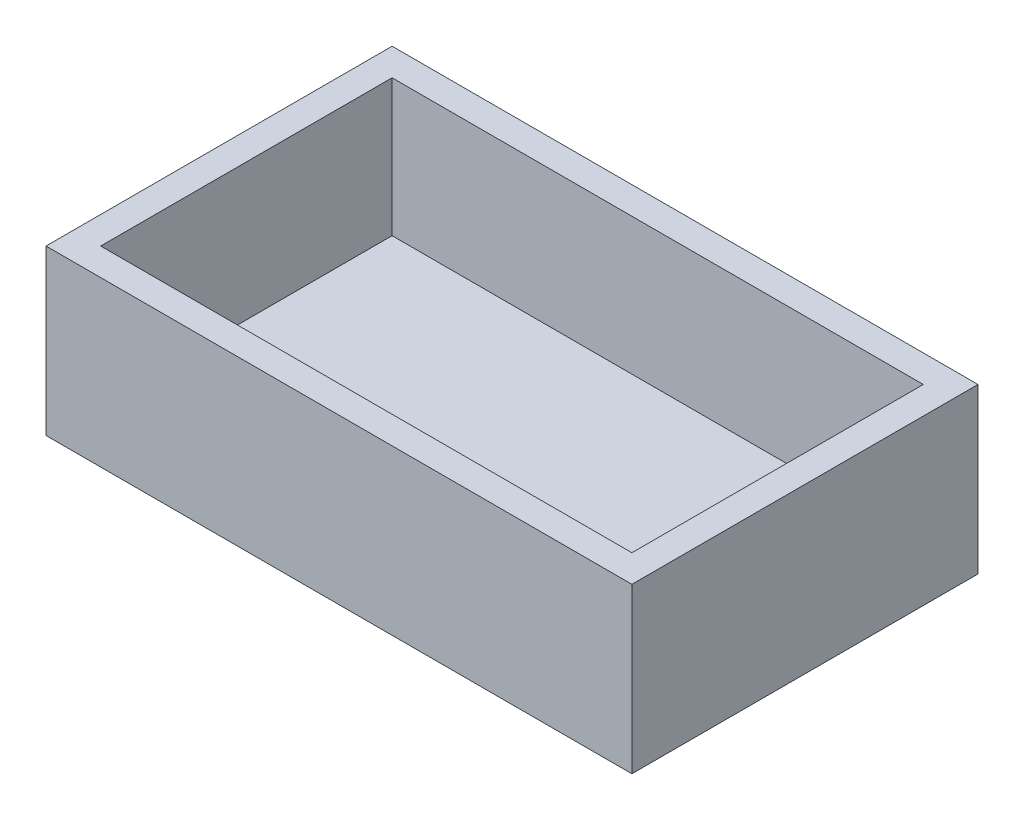
ISO-10303-21;
HEADER;
FILE_DESCRIPTION(('STEP AP214'),'2;1');
FILE_NAME('part.step','',(''),(''),'','','');
FILE_SCHEMA(('AUTOMOTIVE_DESIGN { 1 0 10303 214 1 1 1 1 }'));
ENDSEC;
DATA;
#1=APPLICATION_CONTEXT('core data for automotive mechanical design processes');
#2=APPLICATION_PROTOCOL_DEFINITION('international standard','automotive_design',2000,#1);
#3=PRODUCT_CONTEXT('',#1,'mechanical');
#4=PRODUCT('Part','Part','',(#3));
#5=PRODUCT_RELATED_PRODUCT_CATEGORY('part','',(#4));
#6=PRODUCT_DEFINITION_FORMATION('','',#4);
#7=PRODUCT_DEFINITION_CONTEXT('part definition',#1,'design');
#8=PRODUCT_DEFINITION('design','',#6,#7);
#9=PRODUCT_DEFINITION_SHAPE('','',#8);
#10=(LENGTH_UNIT() NAMED_UNIT(*) SI_UNIT(.MILLI.,.METRE.));
#11=(NAMED_UNIT(*) PLANE_ANGLE_UNIT() SI_UNIT($,.RADIAN.));
#12=(NAMED_UNIT(*) SI_UNIT($,.STERADIAN.) SOLID_ANGLE_UNIT());
#13=UNCERTAINTY_MEASURE_WITH_UNIT(LENGTH_MEASURE(1.E-05),#10,'distance_accuracy_value','');
#14=(GEOMETRIC_REPRESENTATION_CONTEXT(3) GLOBAL_UNCERTAINTY_ASSIGNED_CONTEXT((#13)) GLOBAL_UNIT_ASSIGNED_CONTEXT((#10,
#11,#12)) REPRESENTATION_CONTEXT('',''));
#15=CARTESIAN_POINT('',(0.,0.,0.));
#16=DIRECTION('',(0.,0.,1.));
#17=DIRECTION('',(1.,0.,0.));
#18=AXIS2_PLACEMENT_3D('',#15,#16,#17);
#19=CARTESIAN_POINT('',(0.,60.,0.));
#20=DIRECTION('',(0.,-1.,0.));
#21=DIRECTION('',(0.,0.,-1.));
#22=AXIS2_PLACEMENT_3D('',#19,#20,#21);
#23=PLANE('',#22);
#24=DIRECTION('',(0.,0.,-1.));
#25=VECTOR('',#24,1.);
#26=CARTESIAN_POINT('',(107.104433689421,60.,63.2693529657263));
#27=LINE('',#26,#25);
#28=CARTESIAN_POINT('',(107.104433689421,60.,63.2693529657263));
#29=VERTEX_POINT('',#28);
#30=CARTESIAN_POINT('',(107.104433689421,60.,-63.2693529657263));
#31=VERTEX_POINT('',#30);
#32=EDGE_CURVE('E158',#29,#31,#27,.T.);
#33=ORIENTED_EDGE('',*,*,#32,.T.);
#34=DIRECTION('',(-1.,0.,0.));
#35=VECTOR('',#34,1.);
#36=CARTESIAN_POINT('',(-107.104433689421,60.,-63.2693529657263));
#37=LINE('',#36,#35);
#38=CARTESIAN_POINT('',(-107.104433689421,60.,-63.2693529657263));
#39=VERTEX_POINT('',#38);
#40=EDGE_CURVE('E93',#31,#39,#37,.T.);
#41=ORIENTED_EDGE('',*,*,#40,.T.);
#42=DIRECTION('',(0.,0.,1.));
#43=VECTOR('',#42,1.);
#44=CARTESIAN_POINT('',(-107.104433689421,60.,63.2693529657263));
#45=LINE('',#44,#43);
#46=CARTESIAN_POINT('',(-107.104433689421,60.,63.2693529657263));
#47=VERTEX_POINT('',#46);
#48=EDGE_CURVE('E163',#39,#47,#45,.T.);
#49=ORIENTED_EDGE('',*,*,#48,.T.);
#50=DIRECTION('',(1.,0.,0.));
#51=VECTOR('',#50,1.);
#52=CARTESIAN_POINT('',(-107.104433689421,60.,63.2693529657263));
#53=LINE('',#52,#51);
#54=EDGE_CURVE('E65',#47,#29,#53,.T.);
#55=ORIENTED_EDGE('',*,*,#54,.T.);
#56=EDGE_LOOP('',(#33,#41,#49,#55));
#57=FACE_BOUND('',#56,.T.);
#58=DIRECTION('',(0.,0.,-1.));
#59=VECTOR('',#58,1.);
#60=CARTESIAN_POINT('',(97.1044336894206,60.,0.));
#61=LINE('',#60,#59);
#62=CARTESIAN_POINT('',(97.1044336894206,60.,53.2693529657263));
#63=VERTEX_POINT('',#62);
#64=CARTESIAN_POINT('',(97.1044336894206,60.,-53.2693529657263));
#65=VERTEX_POINT('',#64);
#66=EDGE_CURVE('E142',#63,#65,#61,.T.);
#67=ORIENTED_EDGE('',*,*,#66,.F.);
#68=DIRECTION('',(1.,0.,0.));
#69=VECTOR('',#68,1.);
#70=CARTESIAN_POINT('',(0.,60.,53.2693529657263));
#71=LINE('',#70,#69);
#72=CARTESIAN_POINT('',(-97.1044336894206,60.,53.2693529657263));
#73=VERTEX_POINT('',#72);
#74=EDGE_CURVE('E155',#73,#63,#71,.T.);
#75=ORIENTED_EDGE('',*,*,#74,.F.);
#76=DIRECTION('',(0.,0.,1.));
#77=VECTOR('',#76,1.);
#78=CARTESIAN_POINT('',(-97.1044336894206,60.,0.));
#79=LINE('',#78,#77);
#80=CARTESIAN_POINT('',(-97.1044336894206,60.,-53.2693529657263));
#81=VERTEX_POINT('',#80);
#82=EDGE_CURVE('E152',#81,#73,#79,.T.);
#83=ORIENTED_EDGE('',*,*,#82,.F.);
#84=DIRECTION('',(-1.,0.,0.));
#85=VECTOR('',#84,1.);
#86=CARTESIAN_POINT('',(0.,60.,-53.2693529657263));
#87=LINE('',#86,#85);
#88=EDGE_CURVE('E131',#65,#81,#87,.T.);
#89=ORIENTED_EDGE('',*,*,#88,.F.);
#90=EDGE_LOOP('',(#67,#75,#83,#89));
#91=FACE_BOUND('',#90,.T.);
#92=ADVANCED_FACE('F40',(#57,#91),#23,.F.);
#93=CARTESIAN_POINT('',(107.104433689421,60.,63.2693529657263));
#94=DIRECTION('',(-1.,0.,0.));
#95=DIRECTION('',(0.,0.,1.));
#96=AXIS2_PLACEMENT_3D('',#93,#94,#95);
#97=PLANE('',#96);
#98=DIRECTION('',(0.,0.,-1.));
#99=VECTOR('',#98,1.);
#100=CARTESIAN_POINT('',(107.104433689421,0.,63.2693529657263));
#101=LINE('',#100,#99);
#102=CARTESIAN_POINT('',(107.104433689421,0.,63.2693529657263));
#103=VERTEX_POINT('',#102);
#104=CARTESIAN_POINT('',(107.104433689421,0.,-63.2693529657263));
#105=VERTEX_POINT('',#104);
#106=EDGE_CURVE('E169',#103,#105,#101,.T.);
#107=ORIENTED_EDGE('',*,*,#106,.T.);
#108=DIRECTION('',(0.,-1.,0.));
#109=VECTOR('',#108,1.);
#110=CARTESIAN_POINT('',(107.104433689421,60.,-63.2693529657263));
#111=LINE('',#110,#109);
#112=EDGE_CURVE('E11',#31,#105,#111,.T.);
#113=ORIENTED_EDGE('',*,*,#112,.F.);
#114=ORIENTED_EDGE('',*,*,#32,.F.);
#115=DIRECTION('',(0.,-1.,0.));
#116=VECTOR('',#115,1.);
#117=CARTESIAN_POINT('',(107.104433689421,60.,63.2693529657263));
#118=LINE('',#117,#116);
#119=EDGE_CURVE('E168',#29,#103,#118,.T.);
#120=ORIENTED_EDGE('',*,*,#119,.T.);
#121=EDGE_LOOP('',(#107,#113,#114,#120));
#122=FACE_BOUND('',#121,.T.);
#123=ADVANCED_FACE('F42',(#122),#97,.F.);
#124=CARTESIAN_POINT('',(-107.104433689421,60.,-63.2693529657263));
#125=DIRECTION('',(0.,0.,1.));
#126=DIRECTION('',(1.,0.,0.));
#127=AXIS2_PLACEMENT_3D('',#124,#125,#126);
#128=PLANE('',#127);
#129=DIRECTION('',(-1.,0.,0.));
#130=VECTOR('',#129,1.);
#131=CARTESIAN_POINT('',(-107.104433689421,0.,-63.2693529657263));
#132=LINE('',#131,#130);
#133=CARTESIAN_POINT('',(-107.104433689421,0.,-63.2693529657263));
#134=VERTEX_POINT('',#133);
#135=EDGE_CURVE('E173',#105,#134,#132,.T.);
#136=ORIENTED_EDGE('',*,*,#135,.T.);
#137=DIRECTION('',(0.,-1.,0.));
#138=VECTOR('',#137,1.);
#139=CARTESIAN_POINT('',(-107.104433689421,60.,-63.2693529657263));
#140=LINE('',#139,#138);
#141=EDGE_CURVE('E49',#39,#134,#140,.T.);
#142=ORIENTED_EDGE('',*,*,#141,.F.);
#143=ORIENTED_EDGE('',*,*,#40,.F.);
#144=ORIENTED_EDGE('',*,*,#112,.T.);
#145=EDGE_LOOP('',(#136,#142,#143,#144));
#146=FACE_BOUND('',#145,.T.);
#147=ADVANCED_FACE('F207',(#146),#128,.F.);
#148=CARTESIAN_POINT('',(-107.104433689421,60.,63.2693529657263));
#149=DIRECTION('',(1.,0.,0.));
#150=DIRECTION('',(0.,0.,-1.));
#151=AXIS2_PLACEMENT_3D('',#148,#149,#150);
#152=PLANE('',#151);
#153=DIRECTION('',(0.,0.,1.));
#154=VECTOR('',#153,1.);
#155=CARTESIAN_POINT('',(-107.104433689421,0.,63.2693529657263));
#156=LINE('',#155,#154);
#157=CARTESIAN_POINT('',(-107.104433689421,0.,63.2693529657263));
#158=VERTEX_POINT('',#157);
#159=EDGE_CURVE('E176',#134,#158,#156,.T.);
#160=ORIENTED_EDGE('',*,*,#159,.T.);
#161=DIRECTION('',(0.,-1.,0.));
#162=VECTOR('',#161,1.);
#163=CARTESIAN_POINT('',(-107.104433689421,60.,63.2693529657263));
#164=LINE('',#163,#162);
#165=EDGE_CURVE('E183',#47,#158,#164,.T.);
#166=ORIENTED_EDGE('',*,*,#165,.F.);
#167=ORIENTED_EDGE('',*,*,#48,.F.);
#168=ORIENTED_EDGE('',*,*,#141,.T.);
#169=EDGE_LOOP('',(#160,#166,#167,#168));
#170=FACE_BOUND('',#169,.T.);
#171=ADVANCED_FACE('F190',(#170),#152,.F.);
#172=CARTESIAN_POINT('',(-107.104433689421,60.,63.2693529657263));
#173=DIRECTION('',(0.,0.,-1.));
#174=DIRECTION('',(-1.,0.,0.));
#175=AXIS2_PLACEMENT_3D('',#172,#173,#174);
#176=PLANE('',#175);
#177=DIRECTION('',(1.,0.,0.));
#178=VECTOR('',#177,1.);
#179=CARTESIAN_POINT('',(-107.104433689421,0.,63.2693529657263));
#180=LINE('',#179,#178);
#181=EDGE_CURVE('E86',#158,#103,#180,.T.);
#182=ORIENTED_EDGE('',*,*,#181,.T.);
#183=ORIENTED_EDGE('',*,*,#119,.F.);
#184=ORIENTED_EDGE('',*,*,#54,.F.);
#185=ORIENTED_EDGE('',*,*,#165,.T.);
#186=EDGE_LOOP('',(#182,#183,#184,#185));
#187=FACE_BOUND('',#186,.T.);
#188=ADVANCED_FACE('F198',(#187),#176,.F.);
#189=CARTESIAN_POINT('',(0.,0.,0.));
#190=DIRECTION('',(0.,-1.,0.));
#191=DIRECTION('',(0.,0.,-1.));
#192=AXIS2_PLACEMENT_3D('',#189,#190,#191);
#193=PLANE('',#192);
#194=ORIENTED_EDGE('',*,*,#106,.F.);
#195=ORIENTED_EDGE('',*,*,#181,.F.);
#196=ORIENTED_EDGE('',*,*,#159,.F.);
#197=ORIENTED_EDGE('',*,*,#135,.F.);
#198=EDGE_LOOP('',(#194,#195,#196,#197));
#199=FACE_BOUND('',#198,.T.);
#200=ADVANCED_FACE('F194',(#199),#193,.T.);
#201=CARTESIAN_POINT('',(97.1044336894206,60.,63.2693529657263));
#202=DIRECTION('',(-1.,0.,0.));
#203=DIRECTION('',(0.,0.,1.));
#204=AXIS2_PLACEMENT_3D('',#201,#202,#203);
#205=PLANE('',#204);
#206=DIRECTION('',(0.,0.,-1.));
#207=VECTOR('',#206,1.);
#208=CARTESIAN_POINT('',(97.1044336894206,10.,0.));
#209=LINE('',#208,#207);
#210=CARTESIAN_POINT('',(97.1044336894206,10.,53.2693529657263));
#211=VERTEX_POINT('',#210);
#212=CARTESIAN_POINT('',(97.1044336894206,10.,-53.2693529657263));
#213=VERTEX_POINT('',#212);
#214=EDGE_CURVE('E121',#211,#213,#209,.T.);
#215=ORIENTED_EDGE('',*,*,#214,.F.);
#216=DIRECTION('',(0.,-1.,0.));
#217=VECTOR('',#216,1.);
#218=CARTESIAN_POINT('',(97.1044336894206,60.,53.2693529657263));
#219=LINE('',#218,#217);
#220=EDGE_CURVE('E146',#63,#211,#219,.T.);
#221=ORIENTED_EDGE('',*,*,#220,.F.);
#222=ORIENTED_EDGE('',*,*,#66,.T.);
#223=DIRECTION('',(0.,-1.,0.));
#224=VECTOR('',#223,1.);
#225=CARTESIAN_POINT('',(97.1044336894206,60.,-53.2693529657263));
#226=LINE('',#225,#224);
#227=EDGE_CURVE('E135',#65,#213,#226,.T.);
#228=ORIENTED_EDGE('',*,*,#227,.T.);
#229=EDGE_LOOP('',(#215,#221,#222,#228));
#230=FACE_BOUND('',#229,.T.);
#231=ADVANCED_FACE('F205',(#230),#205,.T.);
#232=CARTESIAN_POINT('',(-107.104433689421,60.,-53.2693529657263));
#233=DIRECTION('',(0.,0.,1.));
#234=DIRECTION('',(1.,0.,0.));
#235=AXIS2_PLACEMENT_3D('',#232,#233,#234);
#236=PLANE('',#235);
#237=DIRECTION('',(-1.,0.,0.));
#238=VECTOR('',#237,1.);
#239=CARTESIAN_POINT('',(0.,10.,-53.2693529657263));
#240=LINE('',#239,#238);
#241=CARTESIAN_POINT('',(-97.1044336894206,10.,-53.2693529657263));
#242=VERTEX_POINT('',#241);
#243=EDGE_CURVE('E115',#213,#242,#240,.T.);
#244=ORIENTED_EDGE('',*,*,#243,.F.);
#245=ORIENTED_EDGE('',*,*,#227,.F.);
#246=ORIENTED_EDGE('',*,*,#88,.T.);
#247=DIRECTION('',(0.,-1.,0.));
#248=VECTOR('',#247,1.);
#249=CARTESIAN_POINT('',(-97.1044336894206,60.,-53.2693529657263));
#250=LINE('',#249,#248);
#251=EDGE_CURVE('E128',#81,#242,#250,.T.);
#252=ORIENTED_EDGE('',*,*,#251,.T.);
#253=EDGE_LOOP('',(#244,#245,#246,#252));
#254=FACE_BOUND('',#253,.T.);
#255=ADVANCED_FACE('F129',(#254),#236,.T.);
#256=CARTESIAN_POINT('',(-97.1044336894206,60.,63.2693529657263));
#257=DIRECTION('',(1.,0.,0.));
#258=DIRECTION('',(0.,0.,-1.));
#259=AXIS2_PLACEMENT_3D('',#256,#257,#258);
#260=PLANE('',#259);
#261=DIRECTION('',(0.,0.,1.));
#262=VECTOR('',#261,1.);
#263=CARTESIAN_POINT('',(-97.1044336894206,10.,0.));
#264=LINE('',#263,#262);
#265=CARTESIAN_POINT('',(-97.1044336894206,10.,53.2693529657263));
#266=VERTEX_POINT('',#265);
#267=EDGE_CURVE('E119',#242,#266,#264,.T.);
#268=ORIENTED_EDGE('',*,*,#267,.F.);
#269=ORIENTED_EDGE('',*,*,#251,.F.);
#270=ORIENTED_EDGE('',*,*,#82,.T.);
#271=DIRECTION('',(0.,-1.,0.));
#272=VECTOR('',#271,1.);
#273=CARTESIAN_POINT('',(-97.1044336894206,60.,53.2693529657263));
#274=LINE('',#273,#272);
#275=EDGE_CURVE('E56',#73,#266,#274,.T.);
#276=ORIENTED_EDGE('',*,*,#275,.T.);
#277=EDGE_LOOP('',(#268,#269,#270,#276));
#278=FACE_BOUND('',#277,.T.);
#279=ADVANCED_FACE('F137',(#278),#260,.T.);
#280=CARTESIAN_POINT('',(-107.104433689421,60.,53.2693529657263));
#281=DIRECTION('',(0.,0.,-1.));
#282=DIRECTION('',(-1.,0.,0.));
#283=AXIS2_PLACEMENT_3D('',#280,#281,#282);
#284=PLANE('',#283);
#285=DIRECTION('',(1.,0.,0.));
#286=VECTOR('',#285,1.);
#287=CARTESIAN_POINT('',(0.,10.,53.2693529657263));
#288=LINE('',#287,#286);
#289=EDGE_CURVE('E139',#266,#211,#288,.T.);
#290=ORIENTED_EDGE('',*,*,#289,.F.);
#291=ORIENTED_EDGE('',*,*,#275,.F.);
#292=ORIENTED_EDGE('',*,*,#74,.T.);
#293=ORIENTED_EDGE('',*,*,#220,.T.);
#294=EDGE_LOOP('',(#290,#291,#292,#293));
#295=FACE_BOUND('',#294,.T.);
#296=ADVANCED_FACE('F220',(#295),#284,.T.);
#297=CARTESIAN_POINT('',(0.,10.,0.));
#298=DIRECTION('',(0.,-1.,0.));
#299=DIRECTION('',(0.,0.,-1.));
#300=AXIS2_PLACEMENT_3D('',#297,#298,#299);
#301=PLANE('',#300);
#302=ORIENTED_EDGE('',*,*,#214,.T.);
#303=ORIENTED_EDGE('',*,*,#243,.T.);
#304=ORIENTED_EDGE('',*,*,#267,.T.);
#305=ORIENTED_EDGE('',*,*,#289,.T.);
#306=EDGE_LOOP('',(#302,#303,#304,#305));
#307=FACE_BOUND('',#306,.T.);
#308=ADVANCED_FACE('F117',(#307),#301,.F.);
#309=CLOSED_SHELL('',(#92,#123,#147,#171,#188,#200,#231,#255,#279,#296,#308));
#310=MANIFOLD_SOLID_BREP('B2',#309);
#311=ADVANCED_BREP_SHAPE_REPRESENTATION('',(#18,#310),#14);
#312=SHAPE_DEFINITION_REPRESENTATION(#9,#311);
ENDSEC;
END-ISO-10303-21;
